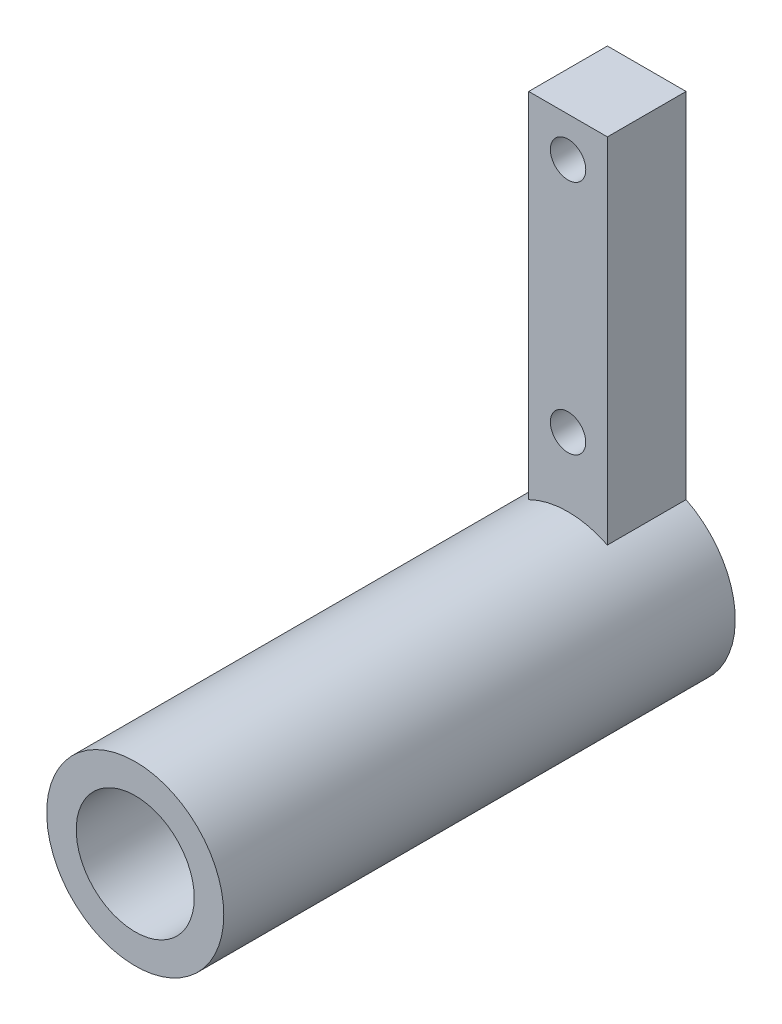
ISO-10303-21;
HEADER;
FILE_DESCRIPTION(('STEP AP214'),'2;1');
FILE_NAME('part.step','',(''),(''),'','','');
FILE_SCHEMA(('AUTOMOTIVE_DESIGN { 1 0 10303 214 1 1 1 1 }'));
ENDSEC;
DATA;
#1=APPLICATION_CONTEXT('core data for automotive mechanical design processes');
#2=APPLICATION_PROTOCOL_DEFINITION('international standard','automotive_design',2000,#1);
#3=PRODUCT_CONTEXT('',#1,'mechanical');
#4=PRODUCT('Part','Part','',(#3));
#5=PRODUCT_RELATED_PRODUCT_CATEGORY('part','',(#4));
#6=PRODUCT_DEFINITION_FORMATION('','',#4);
#7=PRODUCT_DEFINITION_CONTEXT('part definition',#1,'design');
#8=PRODUCT_DEFINITION('design','',#6,#7);
#9=PRODUCT_DEFINITION_SHAPE('','',#8);
#10=(LENGTH_UNIT() NAMED_UNIT(*) SI_UNIT(.MILLI.,.METRE.));
#11=(NAMED_UNIT(*) PLANE_ANGLE_UNIT() SI_UNIT($,.RADIAN.));
#12=(NAMED_UNIT(*) SI_UNIT($,.STERADIAN.) SOLID_ANGLE_UNIT());
#13=UNCERTAINTY_MEASURE_WITH_UNIT(LENGTH_MEASURE(1.E-05),#10,'distance_accuracy_value','');
#14=(GEOMETRIC_REPRESENTATION_CONTEXT(3) GLOBAL_UNCERTAINTY_ASSIGNED_CONTEXT((#13)) GLOBAL_UNIT_ASSIGNED_CONTEXT((#10,
#11,#12)) REPRESENTATION_CONTEXT('',''));
#15=CARTESIAN_POINT('',(0.,0.,0.));
#16=DIRECTION('',(0.,0.,1.));
#17=DIRECTION('',(1.,0.,0.));
#18=AXIS2_PLACEMENT_3D('',#15,#16,#17);
#19=CARTESIAN_POINT('',(0.,0.,130.));
#20=DIRECTION('',(0.,0.,-1.));
#21=DIRECTION('',(-1.,0.,0.));
#22=AXIS2_PLACEMENT_3D('',#19,#20,#21);
#23=CYLINDRICAL_SURFACE('',#22,22.5);
#24=CARTESIAN_POINT('',(0.,0.,130.));
#25=DIRECTION('',(0.,0.,1.));
#26=DIRECTION('',(1.,0.,0.));
#27=AXIS2_PLACEMENT_3D('',#24,#25,#26);
#28=CIRCLE('',#27,22.5);
#29=CARTESIAN_POINT('',(22.5,0.,130.));
#30=VERTEX_POINT('',#29);
#31=EDGE_CURVE('E44',#30,#30,#28,.T.);
#32=ORIENTED_EDGE('',*,*,#31,.F.);
#33=EDGE_LOOP('',(#32));
#34=FACE_BOUND('',#33,.T.);
#35=DIRECTION('',(0.,0.,-1.));
#36=VECTOR('',#35,1.);
#37=CARTESIAN_POINT('',(-10.,20.1556443707464,130.));
#38=LINE('',#37,#36);
#39=CARTESIAN_POINT('',(-10.,20.1556443707464,0.));
#40=VERTEX_POINT('',#39);
#41=CARTESIAN_POINT('',(-10.,20.1556443707464,20.));
#42=VERTEX_POINT('',#41);
#43=EDGE_CURVE('E96',#40,#42,#38,.F.);
#44=ORIENTED_EDGE('',*,*,#43,.F.);
#45=CARTESIAN_POINT('',(0.,0.,0.));
#46=DIRECTION('',(0.,0.,1.));
#47=DIRECTION('',(1.,0.,0.));
#48=AXIS2_PLACEMENT_3D('',#45,#46,#47);
#49=CIRCLE('',#48,22.5);
#50=CARTESIAN_POINT('',(10.,20.1556443707464,0.));
#51=VERTEX_POINT('',#50);
#52=EDGE_CURVE('E104',#40,#51,#49,.T.);
#53=ORIENTED_EDGE('',*,*,#52,.T.);
#54=DIRECTION('',(0.,0.,-1.));
#55=VECTOR('',#54,1.);
#56=CARTESIAN_POINT('',(10.,20.1556443707464,130.));
#57=LINE('',#56,#55);
#58=CARTESIAN_POINT('',(10.,20.1556443707464,20.));
#59=VERTEX_POINT('',#58);
#60=EDGE_CURVE('E54',#59,#51,#57,.T.);
#61=ORIENTED_EDGE('',*,*,#60,.F.);
#62=CARTESIAN_POINT('',(0.,0.,20.));
#63=DIRECTION('',(0.,0.,-1.));
#64=DIRECTION('',(-1.,0.,0.));
#65=AXIS2_PLACEMENT_3D('',#62,#63,#64);
#66=CIRCLE('',#65,22.5);
#67=EDGE_CURVE('E11',#42,#59,#66,.T.);
#68=ORIENTED_EDGE('',*,*,#67,.F.);
#69=EDGE_LOOP('',(#44,#53,#61,#68));
#70=FACE_BOUND('',#69,.T.);
#71=ADVANCED_FACE('F37',(#34,#70),#23,.T.);
#72=CARTESIAN_POINT('',(0.,0.,130.));
#73=DIRECTION('',(0.,0.,1.));
#74=DIRECTION('',(1.,0.,0.));
#75=AXIS2_PLACEMENT_3D('',#72,#73,#74);
#76=PLANE('',#75);
#77=CARTESIAN_POINT('',(0.,0.,130.));
#78=DIRECTION('',(0.,0.,1.));
#79=DIRECTION('',(1.,0.,0.));
#80=AXIS2_PLACEMENT_3D('',#77,#78,#79);
#81=CIRCLE('',#80,15.);
#82=CARTESIAN_POINT('',(15.,0.,130.));
#83=VERTEX_POINT('',#82);
#84=EDGE_CURVE('E132',#83,#83,#81,.T.);
#85=ORIENTED_EDGE('',*,*,#84,.F.);
#86=EDGE_LOOP('',(#85));
#87=FACE_BOUND('',#86,.T.);
#88=ORIENTED_EDGE('',*,*,#31,.T.);
#89=EDGE_LOOP('',(#88));
#90=FACE_BOUND('',#89,.T.);
#91=ADVANCED_FACE('F108',(#87,#90),#76,.T.);
#92=CARTESIAN_POINT('',(0.,0.,0.));
#93=DIRECTION('',(0.,0.,1.));
#94=DIRECTION('',(1.,0.,0.));
#95=AXIS2_PLACEMENT_3D('',#92,#93,#94);
#96=PLANE('',#95);
#97=CARTESIAN_POINT('',(0.,40.,0.));
#98=DIRECTION('',(0.,0.,1.));
#99=DIRECTION('',(1.,0.,0.));
#100=AXIS2_PLACEMENT_3D('',#97,#98,#99);
#101=CIRCLE('',#100,4.50000000000001);
#102=CARTESIAN_POINT('',(4.50000000000001,40.,0.));
#103=VERTEX_POINT('',#102);
#104=EDGE_CURVE('E123',#103,#103,#101,.T.);
#105=ORIENTED_EDGE('',*,*,#104,.T.);
#106=EDGE_LOOP('',(#105));
#107=FACE_BOUND('',#106,.T.);
#108=CARTESIAN_POINT('',(0.,100.,0.));
#109=DIRECTION('',(0.,0.,1.));
#110=DIRECTION('',(1.,0.,0.));
#111=AXIS2_PLACEMENT_3D('',#108,#109,#110);
#112=CIRCLE('',#111,4.5);
#113=CARTESIAN_POINT('',(4.5,100.,0.));
#114=VERTEX_POINT('',#113);
#115=EDGE_CURVE('E93',#114,#114,#112,.T.);
#116=ORIENTED_EDGE('',*,*,#115,.T.);
#117=EDGE_LOOP('',(#116));
#118=FACE_BOUND('',#117,.T.);
#119=ORIENTED_EDGE('',*,*,#52,.F.);
#120=DIRECTION('',(0.,-1.,0.));
#121=VECTOR('',#120,1.);
#122=CARTESIAN_POINT('',(-10.,110.,0.));
#123=LINE('',#122,#121);
#124=CARTESIAN_POINT('',(-10.,110.,0.));
#125=VERTEX_POINT('',#124);
#126=EDGE_CURVE('E111',#125,#40,#123,.T.);
#127=ORIENTED_EDGE('',*,*,#126,.F.);
#128=DIRECTION('',(-1.,0.,0.));
#129=VECTOR('',#128,1.);
#130=CARTESIAN_POINT('',(-10.,110.,0.));
#131=LINE('',#130,#129);
#132=CARTESIAN_POINT('',(10.,110.,0.));
#133=VERTEX_POINT('',#132);
#134=EDGE_CURVE('E89',#133,#125,#131,.T.);
#135=ORIENTED_EDGE('',*,*,#134,.F.);
#136=DIRECTION('',(0.,-1.,0.));
#137=VECTOR('',#136,1.);
#138=CARTESIAN_POINT('',(10.,110.,0.));
#139=LINE('',#138,#137);
#140=EDGE_CURVE('E99',#133,#51,#139,.T.);
#141=ORIENTED_EDGE('',*,*,#140,.T.);
#142=EDGE_LOOP('',(#119,#127,#135,#141));
#143=FACE_BOUND('',#142,.T.);
#144=ADVANCED_FACE('F139',(#107,#118,#143),#96,.F.);
#145=CARTESIAN_POINT('',(-10.,110.,20.));
#146=DIRECTION('',(0.,0.,-1.));
#147=DIRECTION('',(-1.,0.,0.));
#148=AXIS2_PLACEMENT_3D('',#145,#146,#147);
#149=PLANE('',#148);
#150=CARTESIAN_POINT('',(0.,40.,20.));
#151=DIRECTION('',(0.,0.,1.));
#152=DIRECTION('',(1.,0.,0.));
#153=AXIS2_PLACEMENT_3D('',#150,#151,#152);
#154=CIRCLE('',#153,4.50000000000001);
#155=CARTESIAN_POINT('',(4.50000000000001,40.,20.));
#156=VERTEX_POINT('',#155);
#157=EDGE_CURVE('E126',#156,#156,#154,.T.);
#158=ORIENTED_EDGE('',*,*,#157,.F.);
#159=EDGE_LOOP('',(#158));
#160=FACE_BOUND('',#159,.T.);
#161=CARTESIAN_POINT('',(0.,100.,20.));
#162=DIRECTION('',(0.,0.,1.));
#163=DIRECTION('',(1.,0.,0.));
#164=AXIS2_PLACEMENT_3D('',#161,#162,#163);
#165=CIRCLE('',#164,4.5);
#166=CARTESIAN_POINT('',(4.5,100.,20.));
#167=VERTEX_POINT('',#166);
#168=EDGE_CURVE('E120',#167,#167,#165,.T.);
#169=ORIENTED_EDGE('',*,*,#168,.F.);
#170=EDGE_LOOP('',(#169));
#171=FACE_BOUND('',#170,.T.);
#172=DIRECTION('',(0.,-1.,0.));
#173=VECTOR('',#172,1.);
#174=CARTESIAN_POINT('',(-10.,110.,20.));
#175=LINE('',#174,#173);
#176=CARTESIAN_POINT('',(-10.,110.,20.));
#177=VERTEX_POINT('',#176);
#178=EDGE_CURVE('E78',#177,#42,#175,.T.);
#179=ORIENTED_EDGE('',*,*,#178,.T.);
#180=ORIENTED_EDGE('',*,*,#67,.T.);
#181=DIRECTION('',(0.,-1.,0.));
#182=VECTOR('',#181,1.);
#183=CARTESIAN_POINT('',(10.,110.,20.));
#184=LINE('',#183,#182);
#185=CARTESIAN_POINT('',(10.,110.,20.));
#186=VERTEX_POINT('',#185);
#187=EDGE_CURVE('E80',#186,#59,#184,.T.);
#188=ORIENTED_EDGE('',*,*,#187,.F.);
#189=DIRECTION('',(1.,0.,0.));
#190=VECTOR('',#189,1.);
#191=CARTESIAN_POINT('',(-10.,110.,20.));
#192=LINE('',#191,#190);
#193=EDGE_CURVE('E74',#177,#186,#192,.T.);
#194=ORIENTED_EDGE('',*,*,#193,.F.);
#195=EDGE_LOOP('',(#179,#180,#188,#194));
#196=FACE_BOUND('',#195,.T.);
#197=ADVANCED_FACE('F76',(#160,#171,#196),#149,.F.);
#198=CARTESIAN_POINT('',(-10.,110.,0.));
#199=DIRECTION('',(1.,0.,0.));
#200=DIRECTION('',(0.,0.,-1.));
#201=AXIS2_PLACEMENT_3D('',#198,#199,#200);
#202=PLANE('',#201);
#203=ORIENTED_EDGE('',*,*,#126,.T.);
#204=ORIENTED_EDGE('',*,*,#43,.T.);
#205=ORIENTED_EDGE('',*,*,#178,.F.);
#206=DIRECTION('',(0.,0.,1.));
#207=VECTOR('',#206,1.);
#208=CARTESIAN_POINT('',(-10.,110.,0.));
#209=LINE('',#208,#207);
#210=EDGE_CURVE('E84',#125,#177,#209,.T.);
#211=ORIENTED_EDGE('',*,*,#210,.F.);
#212=EDGE_LOOP('',(#203,#204,#205,#211));
#213=FACE_BOUND('',#212,.T.);
#214=ADVANCED_FACE('F95',(#213),#202,.F.);
#215=CARTESIAN_POINT('',(10.,110.,0.));
#216=DIRECTION('',(-1.,0.,0.));
#217=DIRECTION('',(0.,0.,1.));
#218=AXIS2_PLACEMENT_3D('',#215,#216,#217);
#219=PLANE('',#218);
#220=ORIENTED_EDGE('',*,*,#187,.T.);
#221=ORIENTED_EDGE('',*,*,#60,.T.);
#222=ORIENTED_EDGE('',*,*,#140,.F.);
#223=DIRECTION('',(0.,0.,-1.));
#224=VECTOR('',#223,1.);
#225=CARTESIAN_POINT('',(10.,110.,0.));
#226=LINE('',#225,#224);
#227=EDGE_CURVE('E83',#186,#133,#226,.T.);
#228=ORIENTED_EDGE('',*,*,#227,.F.);
#229=EDGE_LOOP('',(#220,#221,#222,#228));
#230=FACE_BOUND('',#229,.T.);
#231=ADVANCED_FACE('F148',(#230),#219,.F.);
#232=CARTESIAN_POINT('',(-10.,110.,20.));
#233=DIRECTION('',(0.,1.,0.));
#234=DIRECTION('',(0.,0.,1.));
#235=AXIS2_PLACEMENT_3D('',#232,#233,#234);
#236=PLANE('',#235);
#237=ORIENTED_EDGE('',*,*,#210,.T.);
#238=ORIENTED_EDGE('',*,*,#193,.T.);
#239=ORIENTED_EDGE('',*,*,#227,.T.);
#240=ORIENTED_EDGE('',*,*,#134,.T.);
#241=EDGE_LOOP('',(#237,#238,#239,#240));
#242=FACE_BOUND('',#241,.T.);
#243=ADVANCED_FACE('F87',(#242),#236,.T.);
#244=CARTESIAN_POINT('',(0.,100.,0.));
#245=DIRECTION('',(0.,0.,1.));
#246=DIRECTION('',(1.,0.,0.));
#247=AXIS2_PLACEMENT_3D('',#244,#245,#246);
#248=CYLINDRICAL_SURFACE('',#247,4.5);
#249=ORIENTED_EDGE('',*,*,#115,.F.);
#250=EDGE_LOOP('',(#249));
#251=FACE_BOUND('',#250,.T.);
#252=ORIENTED_EDGE('',*,*,#168,.T.);
#253=EDGE_LOOP('',(#252));
#254=FACE_BOUND('',#253,.T.);
#255=ADVANCED_FACE('F157',(#251,#254),#248,.F.);
#256=CARTESIAN_POINT('',(0.,40.,0.));
#257=DIRECTION('',(0.,0.,1.));
#258=DIRECTION('',(1.,0.,0.));
#259=AXIS2_PLACEMENT_3D('',#256,#257,#258);
#260=CYLINDRICAL_SURFACE('',#259,4.50000000000001);
#261=ORIENTED_EDGE('',*,*,#104,.F.);
#262=EDGE_LOOP('',(#261));
#263=FACE_BOUND('',#262,.T.);
#264=ORIENTED_EDGE('',*,*,#157,.T.);
#265=EDGE_LOOP('',(#264));
#266=FACE_BOUND('',#265,.T.);
#267=ADVANCED_FACE('F160',(#263,#266),#260,.F.);
#268=CARTESIAN_POINT('',(0.,0.,10.));
#269=DIRECTION('',(0.,0.,1.));
#270=DIRECTION('',(1.,0.,0.));
#271=AXIS2_PLACEMENT_3D('',#268,#269,#270);
#272=CYLINDRICAL_SURFACE('',#271,15.);
#273=CARTESIAN_POINT('',(0.,0.,10.));
#274=DIRECTION('',(0.,0.,1.));
#275=DIRECTION('',(1.,0.,0.));
#276=AXIS2_PLACEMENT_3D('',#273,#274,#275);
#277=CIRCLE('',#276,15.);
#278=CARTESIAN_POINT('',(15.,0.,10.));
#279=VERTEX_POINT('',#278);
#280=EDGE_CURVE('E129',#279,#279,#277,.T.);
#281=ORIENTED_EDGE('',*,*,#280,.F.);
#282=EDGE_LOOP('',(#281));
#283=FACE_BOUND('',#282,.T.);
#284=ORIENTED_EDGE('',*,*,#84,.T.);
#285=EDGE_LOOP('',(#284));
#286=FACE_BOUND('',#285,.T.);
#287=ADVANCED_FACE('F136',(#283,#286),#272,.F.);
#288=CARTESIAN_POINT('',(0.,0.,10.));
#289=DIRECTION('',(0.,0.,1.));
#290=DIRECTION('',(1.,0.,0.));
#291=AXIS2_PLACEMENT_3D('',#288,#289,#290);
#292=PLANE('',#291);
#293=ORIENTED_EDGE('',*,*,#280,.T.);
#294=EDGE_LOOP('',(#293));
#295=FACE_BOUND('',#294,.T.);
#296=ADVANCED_FACE('F167',(#295),#292,.T.);
#297=CLOSED_SHELL('',(#71,#91,#144,#197,#214,#231,#243,#255,#267,#287,#296));
#298=MANIFOLD_SOLID_BREP('B2',#297);
#299=ADVANCED_BREP_SHAPE_REPRESENTATION('',(#18,#298),#14);
#300=SHAPE_DEFINITION_REPRESENTATION(#9,#299);
ENDSEC;
END-ISO-10303-21;
